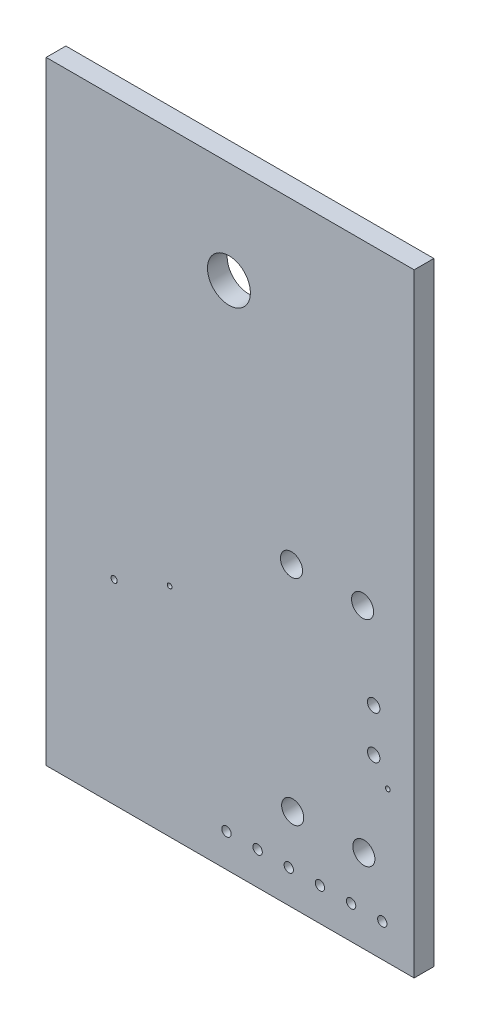
ISO-10303-21;
HEADER;
FILE_DESCRIPTION(('STEP AP214'),'2;1');
FILE_NAME('part.step','',(''),(''),'','','');
FILE_SCHEMA(('AUTOMOTIVE_DESIGN { 1 0 10303 214 1 1 1 1 }'));
ENDSEC;
DATA;
#1=APPLICATION_CONTEXT('core data for automotive mechanical design processes');
#2=APPLICATION_PROTOCOL_DEFINITION('international standard','automotive_design',2000,#1);
#3=PRODUCT_CONTEXT('',#1,'mechanical');
#4=PRODUCT('Part','Part','',(#3));
#5=PRODUCT_RELATED_PRODUCT_CATEGORY('part','',(#4));
#6=PRODUCT_DEFINITION_FORMATION('','',#4);
#7=PRODUCT_DEFINITION_CONTEXT('part definition',#1,'design');
#8=PRODUCT_DEFINITION('design','',#6,#7);
#9=PRODUCT_DEFINITION_SHAPE('','',#8);
#10=(LENGTH_UNIT() NAMED_UNIT(*) SI_UNIT(.MILLI.,.METRE.));
#11=(NAMED_UNIT(*) PLANE_ANGLE_UNIT() SI_UNIT($,.RADIAN.));
#12=(NAMED_UNIT(*) SI_UNIT($,.STERADIAN.) SOLID_ANGLE_UNIT());
#13=UNCERTAINTY_MEASURE_WITH_UNIT(LENGTH_MEASURE(1.E-05),#10,'distance_accuracy_value','');
#14=(GEOMETRIC_REPRESENTATION_CONTEXT(3) GLOBAL_UNCERTAINTY_ASSIGNED_CONTEXT((#13)) GLOBAL_UNIT_ASSIGNED_CONTEXT((#10,
#11,#12)) REPRESENTATION_CONTEXT('',''));
#15=CARTESIAN_POINT('',(0.,0.,0.));
#16=DIRECTION('',(0.,0.,1.));
#17=DIRECTION('',(1.,0.,0.));
#18=AXIS2_PLACEMENT_3D('',#15,#16,#17);
#19=CARTESIAN_POINT('',(0.,50.,-0.803));
#20=DIRECTION('',(0.,0.,-1.));
#21=DIRECTION('',(-1.,0.,0.));
#22=AXIS2_PLACEMENT_3D('',#19,#20,#21);
#23=PLANE('',#22);
#24=CARTESIAN_POINT('',(-15.1,41.7,-0.803));
#25=DIRECTION('',(0.,0.,-1.));
#26=DIRECTION('',(-1.,0.,0.));
#27=AXIS2_PLACEMENT_3D('',#24,#25,#26);
#28=CIRCLE('',#27,1.75);
#29=CARTESIAN_POINT('',(-16.85,41.7,-0.803));
#30=VERTEX_POINT('',#29);
#31=EDGE_CURVE('E124',#30,#30,#28,.F.);
#32=ORIENTED_EDGE('',*,*,#31,.T.);
#33=EDGE_LOOP('',(#32));
#34=FACE_BOUND('',#33,.T.);
#35=CARTESIAN_POINT('',(-4.2,24.2,-0.803));
#36=DIRECTION('',(0.,0.,-1.));
#37=DIRECTION('',(-1.,0.,0.));
#38=AXIS2_PLACEMENT_3D('',#35,#36,#37);
#39=CIRCLE('',#38,0.9);
#40=CARTESIAN_POINT('',(-5.1,24.2,-0.803));
#41=VERTEX_POINT('',#40);
#42=EDGE_CURVE('E127',#41,#41,#39,.F.);
#43=ORIENTED_EDGE('',*,*,#42,.T.);
#44=EDGE_LOOP('',(#43));
#45=FACE_BOUND('',#44,.T.);
#46=CARTESIAN_POINT('',(-10.,24.2,-0.803));
#47=DIRECTION('',(0.,0.,-1.));
#48=DIRECTION('',(-1.,0.,0.));
#49=AXIS2_PLACEMENT_3D('',#46,#47,#48);
#50=CIRCLE('',#49,0.9);
#51=CARTESIAN_POINT('',(-10.9,24.2,-0.803));
#52=VERTEX_POINT('',#51);
#53=EDGE_CURVE('E130',#52,#52,#50,.F.);
#54=ORIENTED_EDGE('',*,*,#53,.T.);
#55=EDGE_LOOP('',(#54));
#56=FACE_BOUND('',#55,.T.);
#57=CARTESIAN_POINT('',(-24.45854,15.91271,-0.803));
#58=DIRECTION('',(0.,0.,-1.));
#59=DIRECTION('',(-1.,0.,0.));
#60=AXIS2_PLACEMENT_3D('',#57,#58,#59);
#61=CIRCLE('',#60,0.254);
#62=CARTESIAN_POINT('',(-24.71254,15.91271,-0.803));
#63=VERTEX_POINT('',#62);
#64=EDGE_CURVE('E133',#63,#63,#61,.F.);
#65=ORIENTED_EDGE('',*,*,#64,.T.);
#66=EDGE_LOOP('',(#65));
#67=FACE_BOUND('',#66,.T.);
#68=CARTESIAN_POINT('',(-3.3,17.6,-0.803));
#69=DIRECTION('',(0.,0.,-1.));
#70=DIRECTION('',(-1.,0.,0.));
#71=AXIS2_PLACEMENT_3D('',#68,#69,#70);
#72=CIRCLE('',#71,0.508);
#73=CARTESIAN_POINT('',(-3.808,17.6,-0.803));
#74=VERTEX_POINT('',#73);
#75=EDGE_CURVE('E136',#74,#74,#72,.F.);
#76=ORIENTED_EDGE('',*,*,#75,.T.);
#77=EDGE_LOOP('',(#76));
#78=FACE_BOUND('',#77,.T.);
#79=CARTESIAN_POINT('',(-19.93533,17.71295,-0.803));
#80=DIRECTION('',(0.,0.,-1.));
#81=DIRECTION('',(-1.,0.,0.));
#82=AXIS2_PLACEMENT_3D('',#79,#80,#81);
#83=CIRCLE('',#82,0.1905);
#84=CARTESIAN_POINT('',(-20.12583,17.71295,-0.803));
#85=VERTEX_POINT('',#84);
#86=EDGE_CURVE('E139',#85,#85,#83,.F.);
#87=ORIENTED_EDGE('',*,*,#86,.T.);
#88=EDGE_LOOP('',(#87));
#89=FACE_BOUND('',#88,.T.);
#90=CARTESIAN_POINT('',(-15.3,2.7,-0.803));
#91=DIRECTION('',(0.,0.,-1.));
#92=DIRECTION('',(-1.,0.,0.));
#93=AXIS2_PLACEMENT_3D('',#90,#91,#92);
#94=CIRCLE('',#93,0.381);
#95=CARTESIAN_POINT('',(-15.681,2.7,-0.803));
#96=VERTEX_POINT('',#95);
#97=EDGE_CURVE('E142',#96,#96,#94,.F.);
#98=ORIENTED_EDGE('',*,*,#97,.T.);
#99=EDGE_LOOP('',(#98));
#100=FACE_BOUND('',#99,.T.);
#101=CARTESIAN_POINT('',(-3.3,14.1,-0.803));
#102=DIRECTION('',(0.,0.,-1.));
#103=DIRECTION('',(-1.,0.,0.));
#104=AXIS2_PLACEMENT_3D('',#101,#102,#103);
#105=CIRCLE('',#104,0.508);
#106=CARTESIAN_POINT('',(-3.808,14.1,-0.803));
#107=VERTEX_POINT('',#106);
#108=EDGE_CURVE('E145',#107,#107,#105,.F.);
#109=ORIENTED_EDGE('',*,*,#108,.T.);
#110=EDGE_LOOP('',(#109));
#111=FACE_BOUND('',#110,.T.);
#112=CARTESIAN_POINT('',(-9.9,6.8,-0.803));
#113=DIRECTION('',(0.,0.,-1.));
#114=DIRECTION('',(-1.,0.,0.));
#115=AXIS2_PLACEMENT_3D('',#112,#113,#114);
#116=CIRCLE('',#115,0.9);
#117=CARTESIAN_POINT('',(-10.8,6.8,-0.803));
#118=VERTEX_POINT('',#117);
#119=EDGE_CURVE('E148',#118,#118,#116,.F.);
#120=ORIENTED_EDGE('',*,*,#119,.T.);
#121=EDGE_LOOP('',(#120));
#122=FACE_BOUND('',#121,.T.);
#123=CARTESIAN_POINT('',(-7.68,2.7,-0.803));
#124=DIRECTION('',(0.,0.,-1.));
#125=DIRECTION('',(-1.,0.,0.));
#126=AXIS2_PLACEMENT_3D('',#123,#124,#125);
#127=CIRCLE('',#126,0.381);
#128=CARTESIAN_POINT('',(-8.061,2.7,-0.803));
#129=VERTEX_POINT('',#128);
#130=EDGE_CURVE('E151',#129,#129,#127,.F.);
#131=ORIENTED_EDGE('',*,*,#130,.T.);
#132=EDGE_LOOP('',(#131));
#133=FACE_BOUND('',#132,.T.);
#134=CARTESIAN_POINT('',(-5.14,2.7,-0.803));
#135=DIRECTION('',(0.,0.,-1.));
#136=DIRECTION('',(-1.,0.,0.));
#137=AXIS2_PLACEMENT_3D('',#134,#135,#136);
#138=CIRCLE('',#137,0.381);
#139=CARTESIAN_POINT('',(-5.521,2.7,-0.803));
#140=VERTEX_POINT('',#139);
#141=EDGE_CURVE('E154',#140,#140,#138,.F.);
#142=ORIENTED_EDGE('',*,*,#141,.T.);
#143=EDGE_LOOP('',(#142));
#144=FACE_BOUND('',#143,.T.);
#145=CARTESIAN_POINT('',(-10.22,2.7,-0.803));
#146=DIRECTION('',(0.,0.,-1.));
#147=DIRECTION('',(-1.,0.,0.));
#148=AXIS2_PLACEMENT_3D('',#145,#146,#147);
#149=CIRCLE('',#148,0.381);
#150=CARTESIAN_POINT('',(-10.601,2.7,-0.803));
#151=VERTEX_POINT('',#150);
#152=EDGE_CURVE('E157',#151,#151,#149,.F.);
#153=ORIENTED_EDGE('',*,*,#152,.T.);
#154=EDGE_LOOP('',(#153));
#155=FACE_BOUND('',#154,.T.);
#156=CARTESIAN_POINT('',(-12.76,2.7,-0.803));
#157=DIRECTION('',(0.,0.,-1.));
#158=DIRECTION('',(-1.,0.,0.));
#159=AXIS2_PLACEMENT_3D('',#156,#157,#158);
#160=CIRCLE('',#159,0.381);
#161=CARTESIAN_POINT('',(-13.141,2.7,-0.803));
#162=VERTEX_POINT('',#161);
#163=EDGE_CURVE('E160',#162,#162,#160,.F.);
#164=ORIENTED_EDGE('',*,*,#163,.T.);
#165=EDGE_LOOP('',(#164));
#166=FACE_BOUND('',#165,.T.);
#167=CARTESIAN_POINT('',(-2.6,2.7,-0.803));
#168=DIRECTION('',(0.,0.,-1.));
#169=DIRECTION('',(-1.,0.,0.));
#170=AXIS2_PLACEMENT_3D('',#167,#168,#169);
#171=CIRCLE('',#170,0.381);
#172=CARTESIAN_POINT('',(-2.981,2.7,-0.803));
#173=VERTEX_POINT('',#172);
#174=EDGE_CURVE('E163',#173,#173,#171,.F.);
#175=ORIENTED_EDGE('',*,*,#174,.T.);
#176=EDGE_LOOP('',(#175));
#177=FACE_BOUND('',#176,.T.);
#178=CARTESIAN_POINT('',(-4.1,6.8,-0.803));
#179=DIRECTION('',(0.,0.,-1.));
#180=DIRECTION('',(-1.,0.,0.));
#181=AXIS2_PLACEMENT_3D('',#178,#179,#180);
#182=CIRCLE('',#181,0.9);
#183=CARTESIAN_POINT('',(-5.,6.8,-0.803));
#184=VERTEX_POINT('',#183);
#185=EDGE_CURVE('E165',#184,#184,#182,.F.);
#186=ORIENTED_EDGE('',*,*,#185,.T.);
#187=EDGE_LOOP('',(#186));
#188=FACE_BOUND('',#187,.T.);
#189=CARTESIAN_POINT('',(-2.15327,12.27531,-0.803));
#190=DIRECTION('',(0.,0.,-1.));
#191=DIRECTION('',(-1.,0.,0.));
#192=AXIS2_PLACEMENT_3D('',#189,#190,#191);
#193=CIRCLE('',#192,0.1905);
#194=CARTESIAN_POINT('',(-2.34377,12.27531,-0.803));
#195=VERTEX_POINT('',#194);
#196=EDGE_CURVE('E19',#195,#195,#193,.F.);
#197=ORIENTED_EDGE('',*,*,#196,.T.);
#198=EDGE_LOOP('',(#197));
#199=FACE_BOUND('',#198,.T.);
#200=DIRECTION('',(1.,0.,0.));
#201=VECTOR('',#200,1.);
#202=CARTESIAN_POINT('',(-30.,0.,-0.803));
#203=LINE('',#202,#201);
#204=CARTESIAN_POINT('',(0.,0.,-0.803));
#205=VERTEX_POINT('',#204);
#206=CARTESIAN_POINT('',(-30.,0.,-0.803));
#207=VERTEX_POINT('',#206);
#208=EDGE_CURVE('E179',#205,#207,#203,.F.);
#209=ORIENTED_EDGE('',*,*,#208,.T.);
#210=DIRECTION('',(0.,1.,0.));
#211=VECTOR('',#210,1.);
#212=CARTESIAN_POINT('',(-30.,50.,-0.803));
#213=LINE('',#212,#211);
#214=CARTESIAN_POINT('',(-30.,50.,-0.803));
#215=VERTEX_POINT('',#214);
#216=EDGE_CURVE('E59',#207,#215,#213,.T.);
#217=ORIENTED_EDGE('',*,*,#216,.T.);
#218=DIRECTION('',(1.,0.,0.));
#219=VECTOR('',#218,1.);
#220=CARTESIAN_POINT('',(0.,50.,-0.803));
#221=LINE('',#220,#219);
#222=CARTESIAN_POINT('',(0.,50.,-0.803));
#223=VERTEX_POINT('',#222);
#224=EDGE_CURVE('E58',#215,#223,#221,.T.);
#225=ORIENTED_EDGE('',*,*,#224,.T.);
#226=DIRECTION('',(0.,1.,0.));
#227=VECTOR('',#226,1.);
#228=CARTESIAN_POINT('',(0.,0.,-0.803));
#229=LINE('',#228,#227);
#230=EDGE_CURVE('E55',#223,#205,#229,.F.);
#231=ORIENTED_EDGE('',*,*,#230,.T.);
#232=EDGE_LOOP('',(#209,#217,#225,#231));
#233=FACE_BOUND('',#232,.T.);
#234=ADVANCED_FACE('F16',(#34,#45,#56,#67,#78,#89,#100,#111,#122,#133,#144,#155,#166,#177,#188,
#199,#233),#23,.T.);
#235=CARTESIAN_POINT('',(0.,50.,-0.803));
#236=DIRECTION('',(0.,-1.,0.));
#237=DIRECTION('',(0.,0.,-1.));
#238=AXIS2_PLACEMENT_3D('',#235,#236,#237);
#239=PLANE('',#238);
#240=DIRECTION('',(0.,0.,-1.));
#241=VECTOR('',#240,1.);
#242=CARTESIAN_POINT('',(-30.,50.,-0.803));
#243=LINE('',#242,#241);
#244=CARTESIAN_POINT('',(-30.,50.,0.803));
#245=VERTEX_POINT('',#244);
#246=EDGE_CURVE('E173',#215,#245,#243,.F.);
#247=ORIENTED_EDGE('',*,*,#246,.T.);
#248=DIRECTION('',(-1.,0.,0.));
#249=VECTOR('',#248,1.);
#250=CARTESIAN_POINT('',(0.,50.,0.803));
#251=LINE('',#250,#249);
#252=CARTESIAN_POINT('',(0.,50.,0.803));
#253=VERTEX_POINT('',#252);
#254=EDGE_CURVE('E75',#245,#253,#251,.F.);
#255=ORIENTED_EDGE('',*,*,#254,.T.);
#256=DIRECTION('',(0.,0.,1.));
#257=VECTOR('',#256,1.);
#258=CARTESIAN_POINT('',(0.,50.,-0.803));
#259=LINE('',#258,#257);
#260=EDGE_CURVE('E64',#253,#223,#259,.F.);
#261=ORIENTED_EDGE('',*,*,#260,.T.);
#262=ORIENTED_EDGE('',*,*,#224,.F.);
#263=EDGE_LOOP('',(#247,#255,#261,#262));
#264=FACE_BOUND('',#263,.T.);
#265=ADVANCED_FACE('F74',(#264),#239,.F.);
#266=CARTESIAN_POINT('',(0.,0.,-0.803));
#267=DIRECTION('',(-1.,0.,0.));
#268=DIRECTION('',(0.,0.,1.));
#269=AXIS2_PLACEMENT_3D('',#266,#267,#268);
#270=PLANE('',#269);
#271=ORIENTED_EDGE('',*,*,#260,.F.);
#272=DIRECTION('',(0.,1.,0.));
#273=VECTOR('',#272,1.);
#274=CARTESIAN_POINT('',(0.,50.,0.803));
#275=LINE('',#274,#273);
#276=CARTESIAN_POINT('',(0.,0.,0.803));
#277=VERTEX_POINT('',#276);
#278=EDGE_CURVE('E187',#253,#277,#275,.F.);
#279=ORIENTED_EDGE('',*,*,#278,.T.);
#280=DIRECTION('',(0.,0.,1.));
#281=VECTOR('',#280,1.);
#282=CARTESIAN_POINT('',(0.,0.,-0.803));
#283=LINE('',#282,#281);
#284=EDGE_CURVE('E71',#277,#205,#283,.F.);
#285=ORIENTED_EDGE('',*,*,#284,.T.);
#286=ORIENTED_EDGE('',*,*,#230,.F.);
#287=EDGE_LOOP('',(#271,#279,#285,#286));
#288=FACE_BOUND('',#287,.T.);
#289=ADVANCED_FACE('F68',(#288),#270,.F.);
#290=CARTESIAN_POINT('',(-30.,0.,-0.803));
#291=DIRECTION('',(0.,1.,0.));
#292=DIRECTION('',(0.,0.,1.));
#293=AXIS2_PLACEMENT_3D('',#290,#291,#292);
#294=PLANE('',#293);
#295=ORIENTED_EDGE('',*,*,#284,.F.);
#296=DIRECTION('',(-1.,0.,0.));
#297=VECTOR('',#296,1.);
#298=CARTESIAN_POINT('',(0.,0.,0.803));
#299=LINE('',#298,#297);
#300=CARTESIAN_POINT('',(-30.,0.,0.803));
#301=VERTEX_POINT('',#300);
#302=EDGE_CURVE('E185',#277,#301,#299,.T.);
#303=ORIENTED_EDGE('',*,*,#302,.T.);
#304=DIRECTION('',(0.,0.,-1.));
#305=VECTOR('',#304,1.);
#306=CARTESIAN_POINT('',(-30.,0.,-0.803));
#307=LINE('',#306,#305);
#308=EDGE_CURVE('E34',#301,#207,#307,.T.);
#309=ORIENTED_EDGE('',*,*,#308,.T.);
#310=ORIENTED_EDGE('',*,*,#208,.F.);
#311=EDGE_LOOP('',(#295,#303,#309,#310));
#312=FACE_BOUND('',#311,.T.);
#313=ADVANCED_FACE('F183',(#312),#294,.F.);
#314=CARTESIAN_POINT('',(-30.,50.,-0.803));
#315=DIRECTION('',(1.,0.,0.));
#316=DIRECTION('',(0.,0.,-1.));
#317=AXIS2_PLACEMENT_3D('',#314,#315,#316);
#318=PLANE('',#317);
#319=ORIENTED_EDGE('',*,*,#308,.F.);
#320=DIRECTION('',(0.,1.,0.));
#321=VECTOR('',#320,1.);
#322=CARTESIAN_POINT('',(-30.,50.,0.803));
#323=LINE('',#322,#321);
#324=EDGE_CURVE('E123',#301,#245,#323,.T.);
#325=ORIENTED_EDGE('',*,*,#324,.T.);
#326=ORIENTED_EDGE('',*,*,#246,.F.);
#327=ORIENTED_EDGE('',*,*,#216,.F.);
#328=EDGE_LOOP('',(#319,#325,#326,#327));
#329=FACE_BOUND('',#328,.T.);
#330=ADVANCED_FACE('F181',(#329),#318,.F.);
#331=CARTESIAN_POINT('',(-2.15327,12.27531,-0.803));
#332=DIRECTION('',(0.,0.,-1.));
#333=DIRECTION('',(-1.,0.,0.));
#334=AXIS2_PLACEMENT_3D('',#331,#332,#333);
#335=CYLINDRICAL_SURFACE('',#334,0.1905);
#336=CARTESIAN_POINT('',(-2.15327,12.27531,0.803));
#337=DIRECTION('',(0.,0.,-1.));
#338=DIRECTION('',(-1.,0.,0.));
#339=AXIS2_PLACEMENT_3D('',#336,#337,#338);
#340=CIRCLE('',#339,0.1905);
#341=CARTESIAN_POINT('',(-2.34377,12.27531,0.803));
#342=VERTEX_POINT('',#341);
#343=EDGE_CURVE('E120',#342,#342,#340,.F.);
#344=ORIENTED_EDGE('',*,*,#343,.T.);
#345=EDGE_LOOP('',(#344));
#346=FACE_BOUND('',#345,.T.);
#347=ORIENTED_EDGE('',*,*,#196,.F.);
#348=EDGE_LOOP('',(#347));
#349=FACE_BOUND('',#348,.T.);
#350=ADVANCED_FACE('F259',(#346,#349),#335,.F.);
#351=CARTESIAN_POINT('',(-4.1,6.8,-0.803));
#352=DIRECTION('',(0.,0.,-1.));
#353=DIRECTION('',(-1.,0.,0.));
#354=AXIS2_PLACEMENT_3D('',#351,#352,#353);
#355=CYLINDRICAL_SURFACE('',#354,0.9);
#356=CARTESIAN_POINT('',(-4.1,6.8,0.803));
#357=DIRECTION('',(0.,0.,-1.));
#358=DIRECTION('',(-1.,0.,0.));
#359=AXIS2_PLACEMENT_3D('',#356,#357,#358);
#360=CIRCLE('',#359,0.9);
#361=CARTESIAN_POINT('',(-5.,6.8,0.803));
#362=VERTEX_POINT('',#361);
#363=EDGE_CURVE('E117',#362,#362,#360,.F.);
#364=ORIENTED_EDGE('',*,*,#363,.T.);
#365=EDGE_LOOP('',(#364));
#366=FACE_BOUND('',#365,.T.);
#367=ORIENTED_EDGE('',*,*,#185,.F.);
#368=EDGE_LOOP('',(#367));
#369=FACE_BOUND('',#368,.T.);
#370=ADVANCED_FACE('F255',(#366,#369),#355,.F.);
#371=CARTESIAN_POINT('',(-2.6,2.7,-0.803));
#372=DIRECTION('',(0.,0.,-1.));
#373=DIRECTION('',(-1.,0.,0.));
#374=AXIS2_PLACEMENT_3D('',#371,#372,#373);
#375=CYLINDRICAL_SURFACE('',#374,0.381);
#376=CARTESIAN_POINT('',(-2.6,2.7,0.803));
#377=DIRECTION('',(0.,0.,-1.));
#378=DIRECTION('',(-1.,0.,0.));
#379=AXIS2_PLACEMENT_3D('',#376,#377,#378);
#380=CIRCLE('',#379,0.381);
#381=CARTESIAN_POINT('',(-2.981,2.7,0.803));
#382=VERTEX_POINT('',#381);
#383=EDGE_CURVE('E114',#382,#382,#380,.F.);
#384=ORIENTED_EDGE('',*,*,#383,.T.);
#385=EDGE_LOOP('',(#384));
#386=FACE_BOUND('',#385,.T.);
#387=ORIENTED_EDGE('',*,*,#174,.F.);
#388=EDGE_LOOP('',(#387));
#389=FACE_BOUND('',#388,.T.);
#390=ADVANCED_FACE('F251',(#386,#389),#375,.F.);
#391=CARTESIAN_POINT('',(-12.76,2.7,-0.803));
#392=DIRECTION('',(0.,0.,-1.));
#393=DIRECTION('',(-1.,0.,0.));
#394=AXIS2_PLACEMENT_3D('',#391,#392,#393);
#395=CYLINDRICAL_SURFACE('',#394,0.381);
#396=CARTESIAN_POINT('',(-12.76,2.7,0.803));
#397=DIRECTION('',(0.,0.,-1.));
#398=DIRECTION('',(-1.,0.,0.));
#399=AXIS2_PLACEMENT_3D('',#396,#397,#398);
#400=CIRCLE('',#399,0.381);
#401=CARTESIAN_POINT('',(-13.141,2.7,0.803));
#402=VERTEX_POINT('',#401);
#403=EDGE_CURVE('E111',#402,#402,#400,.F.);
#404=ORIENTED_EDGE('',*,*,#403,.T.);
#405=EDGE_LOOP('',(#404));
#406=FACE_BOUND('',#405,.T.);
#407=ORIENTED_EDGE('',*,*,#163,.F.);
#408=EDGE_LOOP('',(#407));
#409=FACE_BOUND('',#408,.T.);
#410=ADVANCED_FACE('F247',(#406,#409),#395,.F.);
#411=CARTESIAN_POINT('',(-10.22,2.7,-0.803));
#412=DIRECTION('',(0.,0.,-1.));
#413=DIRECTION('',(-1.,0.,0.));
#414=AXIS2_PLACEMENT_3D('',#411,#412,#413);
#415=CYLINDRICAL_SURFACE('',#414,0.381);
#416=CARTESIAN_POINT('',(-10.22,2.7,0.803));
#417=DIRECTION('',(0.,0.,-1.));
#418=DIRECTION('',(-1.,0.,0.));
#419=AXIS2_PLACEMENT_3D('',#416,#417,#418);
#420=CIRCLE('',#419,0.381);
#421=CARTESIAN_POINT('',(-10.601,2.7,0.803));
#422=VERTEX_POINT('',#421);
#423=EDGE_CURVE('E108',#422,#422,#420,.F.);
#424=ORIENTED_EDGE('',*,*,#423,.T.);
#425=EDGE_LOOP('',(#424));
#426=FACE_BOUND('',#425,.T.);
#427=ORIENTED_EDGE('',*,*,#152,.F.);
#428=EDGE_LOOP('',(#427));
#429=FACE_BOUND('',#428,.T.);
#430=ADVANCED_FACE('F243',(#426,#429),#415,.F.);
#431=CARTESIAN_POINT('',(-5.14,2.7,-0.803));
#432=DIRECTION('',(0.,0.,-1.));
#433=DIRECTION('',(-1.,0.,0.));
#434=AXIS2_PLACEMENT_3D('',#431,#432,#433);
#435=CYLINDRICAL_SURFACE('',#434,0.381);
#436=CARTESIAN_POINT('',(-5.14,2.7,0.803));
#437=DIRECTION('',(0.,0.,-1.));
#438=DIRECTION('',(-1.,0.,0.));
#439=AXIS2_PLACEMENT_3D('',#436,#437,#438);
#440=CIRCLE('',#439,0.381);
#441=CARTESIAN_POINT('',(-5.521,2.7,0.803));
#442=VERTEX_POINT('',#441);
#443=EDGE_CURVE('E105',#442,#442,#440,.F.);
#444=ORIENTED_EDGE('',*,*,#443,.T.);
#445=EDGE_LOOP('',(#444));
#446=FACE_BOUND('',#445,.T.);
#447=ORIENTED_EDGE('',*,*,#141,.F.);
#448=EDGE_LOOP('',(#447));
#449=FACE_BOUND('',#448,.T.);
#450=ADVANCED_FACE('F239',(#446,#449),#435,.F.);
#451=CARTESIAN_POINT('',(-7.68,2.7,-0.803));
#452=DIRECTION('',(0.,0.,-1.));
#453=DIRECTION('',(-1.,0.,0.));
#454=AXIS2_PLACEMENT_3D('',#451,#452,#453);
#455=CYLINDRICAL_SURFACE('',#454,0.381);
#456=CARTESIAN_POINT('',(-7.68,2.7,0.803));
#457=DIRECTION('',(0.,0.,-1.));
#458=DIRECTION('',(-1.,0.,0.));
#459=AXIS2_PLACEMENT_3D('',#456,#457,#458);
#460=CIRCLE('',#459,0.381);
#461=CARTESIAN_POINT('',(-8.061,2.7,0.803));
#462=VERTEX_POINT('',#461);
#463=EDGE_CURVE('E102',#462,#462,#460,.F.);
#464=ORIENTED_EDGE('',*,*,#463,.T.);
#465=EDGE_LOOP('',(#464));
#466=FACE_BOUND('',#465,.T.);
#467=ORIENTED_EDGE('',*,*,#130,.F.);
#468=EDGE_LOOP('',(#467));
#469=FACE_BOUND('',#468,.T.);
#470=ADVANCED_FACE('F235',(#466,#469),#455,.F.);
#471=CARTESIAN_POINT('',(-9.9,6.8,-0.803));
#472=DIRECTION('',(0.,0.,-1.));
#473=DIRECTION('',(-1.,0.,0.));
#474=AXIS2_PLACEMENT_3D('',#471,#472,#473);
#475=CYLINDRICAL_SURFACE('',#474,0.9);
#476=CARTESIAN_POINT('',(-9.9,6.8,0.803));
#477=DIRECTION('',(0.,0.,-1.));
#478=DIRECTION('',(-1.,0.,0.));
#479=AXIS2_PLACEMENT_3D('',#476,#477,#478);
#480=CIRCLE('',#479,0.9);
#481=CARTESIAN_POINT('',(-10.8,6.8,0.803));
#482=VERTEX_POINT('',#481);
#483=EDGE_CURVE('E99',#482,#482,#480,.F.);
#484=ORIENTED_EDGE('',*,*,#483,.T.);
#485=EDGE_LOOP('',(#484));
#486=FACE_BOUND('',#485,.T.);
#487=ORIENTED_EDGE('',*,*,#119,.F.);
#488=EDGE_LOOP('',(#487));
#489=FACE_BOUND('',#488,.T.);
#490=ADVANCED_FACE('F231',(#486,#489),#475,.F.);
#491=CARTESIAN_POINT('',(-3.3,14.1,-0.803));
#492=DIRECTION('',(0.,0.,-1.));
#493=DIRECTION('',(-1.,0.,0.));
#494=AXIS2_PLACEMENT_3D('',#491,#492,#493);
#495=CYLINDRICAL_SURFACE('',#494,0.508);
#496=CARTESIAN_POINT('',(-3.3,14.1,0.803));
#497=DIRECTION('',(0.,0.,-1.));
#498=DIRECTION('',(-1.,0.,0.));
#499=AXIS2_PLACEMENT_3D('',#496,#497,#498);
#500=CIRCLE('',#499,0.508);
#501=CARTESIAN_POINT('',(-3.808,14.1,0.803));
#502=VERTEX_POINT('',#501);
#503=EDGE_CURVE('E96',#502,#502,#500,.F.);
#504=ORIENTED_EDGE('',*,*,#503,.T.);
#505=EDGE_LOOP('',(#504));
#506=FACE_BOUND('',#505,.T.);
#507=ORIENTED_EDGE('',*,*,#108,.F.);
#508=EDGE_LOOP('',(#507));
#509=FACE_BOUND('',#508,.T.);
#510=ADVANCED_FACE('F227',(#506,#509),#495,.F.);
#511=CARTESIAN_POINT('',(-15.3,2.7,-0.803));
#512=DIRECTION('',(0.,0.,-1.));
#513=DIRECTION('',(-1.,0.,0.));
#514=AXIS2_PLACEMENT_3D('',#511,#512,#513);
#515=CYLINDRICAL_SURFACE('',#514,0.381);
#516=CARTESIAN_POINT('',(-15.3,2.7,0.803));
#517=DIRECTION('',(0.,0.,-1.));
#518=DIRECTION('',(-1.,0.,0.));
#519=AXIS2_PLACEMENT_3D('',#516,#517,#518);
#520=CIRCLE('',#519,0.381);
#521=CARTESIAN_POINT('',(-15.681,2.7,0.803));
#522=VERTEX_POINT('',#521);
#523=EDGE_CURVE('E93',#522,#522,#520,.F.);
#524=ORIENTED_EDGE('',*,*,#523,.T.);
#525=EDGE_LOOP('',(#524));
#526=FACE_BOUND('',#525,.T.);
#527=ORIENTED_EDGE('',*,*,#97,.F.);
#528=EDGE_LOOP('',(#527));
#529=FACE_BOUND('',#528,.T.);
#530=ADVANCED_FACE('F223',(#526,#529),#515,.F.);
#531=CARTESIAN_POINT('',(-19.93533,17.71295,-0.803));
#532=DIRECTION('',(0.,0.,-1.));
#533=DIRECTION('',(-1.,0.,0.));
#534=AXIS2_PLACEMENT_3D('',#531,#532,#533);
#535=CYLINDRICAL_SURFACE('',#534,0.1905);
#536=CARTESIAN_POINT('',(-19.93533,17.71295,0.803));
#537=DIRECTION('',(0.,0.,-1.));
#538=DIRECTION('',(-1.,0.,0.));
#539=AXIS2_PLACEMENT_3D('',#536,#537,#538);
#540=CIRCLE('',#539,0.1905);
#541=CARTESIAN_POINT('',(-20.12583,17.71295,0.803));
#542=VERTEX_POINT('',#541);
#543=EDGE_CURVE('E90',#542,#542,#540,.F.);
#544=ORIENTED_EDGE('',*,*,#543,.T.);
#545=EDGE_LOOP('',(#544));
#546=FACE_BOUND('',#545,.T.);
#547=ORIENTED_EDGE('',*,*,#86,.F.);
#548=EDGE_LOOP('',(#547));
#549=FACE_BOUND('',#548,.T.);
#550=ADVANCED_FACE('F219',(#546,#549),#535,.F.);
#551=CARTESIAN_POINT('',(-3.3,17.6,-0.803));
#552=DIRECTION('',(0.,0.,-1.));
#553=DIRECTION('',(-1.,0.,0.));
#554=AXIS2_PLACEMENT_3D('',#551,#552,#553);
#555=CYLINDRICAL_SURFACE('',#554,0.508);
#556=CARTESIAN_POINT('',(-3.3,17.6,0.803));
#557=DIRECTION('',(0.,0.,-1.));
#558=DIRECTION('',(-1.,0.,0.));
#559=AXIS2_PLACEMENT_3D('',#556,#557,#558);
#560=CIRCLE('',#559,0.508);
#561=CARTESIAN_POINT('',(-3.808,17.6,0.803));
#562=VERTEX_POINT('',#561);
#563=EDGE_CURVE('E87',#562,#562,#560,.F.);
#564=ORIENTED_EDGE('',*,*,#563,.T.);
#565=EDGE_LOOP('',(#564));
#566=FACE_BOUND('',#565,.T.);
#567=ORIENTED_EDGE('',*,*,#75,.F.);
#568=EDGE_LOOP('',(#567));
#569=FACE_BOUND('',#568,.T.);
#570=ADVANCED_FACE('F215',(#566,#569),#555,.F.);
#571=CARTESIAN_POINT('',(-24.45854,15.91271,-0.803));
#572=DIRECTION('',(0.,0.,-1.));
#573=DIRECTION('',(-1.,0.,0.));
#574=AXIS2_PLACEMENT_3D('',#571,#572,#573);
#575=CYLINDRICAL_SURFACE('',#574,0.254);
#576=CARTESIAN_POINT('',(-24.45854,15.91271,0.803));
#577=DIRECTION('',(0.,0.,-1.));
#578=DIRECTION('',(-1.,0.,0.));
#579=AXIS2_PLACEMENT_3D('',#576,#577,#578);
#580=CIRCLE('',#579,0.254);
#581=CARTESIAN_POINT('',(-24.71254,15.91271,0.803));
#582=VERTEX_POINT('',#581);
#583=EDGE_CURVE('E84',#582,#582,#580,.F.);
#584=ORIENTED_EDGE('',*,*,#583,.T.);
#585=EDGE_LOOP('',(#584));
#586=FACE_BOUND('',#585,.T.);
#587=ORIENTED_EDGE('',*,*,#64,.F.);
#588=EDGE_LOOP('',(#587));
#589=FACE_BOUND('',#588,.T.);
#590=ADVANCED_FACE('F211',(#586,#589),#575,.F.);
#591=CARTESIAN_POINT('',(-10.,24.2,-0.803));
#592=DIRECTION('',(0.,0.,-1.));
#593=DIRECTION('',(-1.,0.,0.));
#594=AXIS2_PLACEMENT_3D('',#591,#592,#593);
#595=CYLINDRICAL_SURFACE('',#594,0.9);
#596=CARTESIAN_POINT('',(-10.,24.2,0.803));
#597=DIRECTION('',(0.,0.,-1.));
#598=DIRECTION('',(-1.,0.,0.));
#599=AXIS2_PLACEMENT_3D('',#596,#597,#598);
#600=CIRCLE('',#599,0.9);
#601=CARTESIAN_POINT('',(-10.9,24.2,0.803));
#602=VERTEX_POINT('',#601);
#603=EDGE_CURVE('E81',#602,#602,#600,.F.);
#604=ORIENTED_EDGE('',*,*,#603,.T.);
#605=EDGE_LOOP('',(#604));
#606=FACE_BOUND('',#605,.T.);
#607=ORIENTED_EDGE('',*,*,#53,.F.);
#608=EDGE_LOOP('',(#607));
#609=FACE_BOUND('',#608,.T.);
#610=ADVANCED_FACE('F207',(#606,#609),#595,.F.);
#611=CARTESIAN_POINT('',(-4.2,24.2,-0.803));
#612=DIRECTION('',(0.,0.,-1.));
#613=DIRECTION('',(-1.,0.,0.));
#614=AXIS2_PLACEMENT_3D('',#611,#612,#613);
#615=CYLINDRICAL_SURFACE('',#614,0.9);
#616=CARTESIAN_POINT('',(-4.2,24.2,0.803));
#617=DIRECTION('',(0.,0.,-1.));
#618=DIRECTION('',(-1.,0.,0.));
#619=AXIS2_PLACEMENT_3D('',#616,#617,#618);
#620=CIRCLE('',#619,0.9);
#621=CARTESIAN_POINT('',(-5.1,24.2,0.803));
#622=VERTEX_POINT('',#621);
#623=EDGE_CURVE('E25',#622,#622,#620,.F.);
#624=ORIENTED_EDGE('',*,*,#623,.T.);
#625=EDGE_LOOP('',(#624));
#626=FACE_BOUND('',#625,.T.);
#627=ORIENTED_EDGE('',*,*,#42,.F.);
#628=EDGE_LOOP('',(#627));
#629=FACE_BOUND('',#628,.T.);
#630=ADVANCED_FACE('F199',(#626,#629),#615,.F.);
#631=CARTESIAN_POINT('',(-15.1,41.7,-0.803));
#632=DIRECTION('',(0.,0.,-1.));
#633=DIRECTION('',(-1.,0.,0.));
#634=AXIS2_PLACEMENT_3D('',#631,#632,#633);
#635=CYLINDRICAL_SURFACE('',#634,1.75);
#636=CARTESIAN_POINT('',(-15.1,41.7,0.803));
#637=DIRECTION('',(0.,0.,-1.));
#638=DIRECTION('',(-1.,0.,0.));
#639=AXIS2_PLACEMENT_3D('',#636,#637,#638);
#640=CIRCLE('',#639,1.75);
#641=CARTESIAN_POINT('',(-16.85,41.7,0.803));
#642=VERTEX_POINT('',#641);
#643=EDGE_CURVE('E11',#642,#642,#640,.F.);
#644=ORIENTED_EDGE('',*,*,#643,.T.);
#645=EDGE_LOOP('',(#644));
#646=FACE_BOUND('',#645,.T.);
#647=ORIENTED_EDGE('',*,*,#31,.F.);
#648=EDGE_LOOP('',(#647));
#649=FACE_BOUND('',#648,.T.);
#650=ADVANCED_FACE('F192',(#646,#649),#635,.F.);
#651=CARTESIAN_POINT('',(0.,50.,0.803));
#652=DIRECTION('',(0.,0.,-1.));
#653=DIRECTION('',(-1.,0.,0.));
#654=AXIS2_PLACEMENT_3D('',#651,#652,#653);
#655=PLANE('',#654);
#656=ORIENTED_EDGE('',*,*,#643,.F.);
#657=EDGE_LOOP('',(#656));
#658=FACE_BOUND('',#657,.T.);
#659=ORIENTED_EDGE('',*,*,#623,.F.);
#660=EDGE_LOOP('',(#659));
#661=FACE_BOUND('',#660,.T.);
#662=ORIENTED_EDGE('',*,*,#603,.F.);
#663=EDGE_LOOP('',(#662));
#664=FACE_BOUND('',#663,.T.);
#665=ORIENTED_EDGE('',*,*,#583,.F.);
#666=EDGE_LOOP('',(#665));
#667=FACE_BOUND('',#666,.T.);
#668=ORIENTED_EDGE('',*,*,#563,.F.);
#669=EDGE_LOOP('',(#668));
#670=FACE_BOUND('',#669,.T.);
#671=ORIENTED_EDGE('',*,*,#543,.F.);
#672=EDGE_LOOP('',(#671));
#673=FACE_BOUND('',#672,.T.);
#674=ORIENTED_EDGE('',*,*,#523,.F.);
#675=EDGE_LOOP('',(#674));
#676=FACE_BOUND('',#675,.T.);
#677=ORIENTED_EDGE('',*,*,#503,.F.);
#678=EDGE_LOOP('',(#677));
#679=FACE_BOUND('',#678,.T.);
#680=ORIENTED_EDGE('',*,*,#483,.F.);
#681=EDGE_LOOP('',(#680));
#682=FACE_BOUND('',#681,.T.);
#683=ORIENTED_EDGE('',*,*,#463,.F.);
#684=EDGE_LOOP('',(#683));
#685=FACE_BOUND('',#684,.T.);
#686=ORIENTED_EDGE('',*,*,#443,.F.);
#687=EDGE_LOOP('',(#686));
#688=FACE_BOUND('',#687,.T.);
#689=ORIENTED_EDGE('',*,*,#423,.F.);
#690=EDGE_LOOP('',(#689));
#691=FACE_BOUND('',#690,.T.);
#692=ORIENTED_EDGE('',*,*,#403,.F.);
#693=EDGE_LOOP('',(#692));
#694=FACE_BOUND('',#693,.T.);
#695=ORIENTED_EDGE('',*,*,#383,.F.);
#696=EDGE_LOOP('',(#695));
#697=FACE_BOUND('',#696,.T.);
#698=ORIENTED_EDGE('',*,*,#363,.F.);
#699=EDGE_LOOP('',(#698));
#700=FACE_BOUND('',#699,.T.);
#701=ORIENTED_EDGE('',*,*,#343,.F.);
#702=EDGE_LOOP('',(#701));
#703=FACE_BOUND('',#702,.T.);
#704=ORIENTED_EDGE('',*,*,#302,.F.);
#705=ORIENTED_EDGE('',*,*,#278,.F.);
#706=ORIENTED_EDGE('',*,*,#254,.F.);
#707=ORIENTED_EDGE('',*,*,#324,.F.);
#708=EDGE_LOOP('',(#704,#705,#706,#707));
#709=FACE_BOUND('',#708,.T.);
#710=ADVANCED_FACE('F190',(#658,#661,#664,#667,#670,#673,#676,#679,#682,#685,#688,#691,#694,
#697,#700,#703,#709),#655,.F.);
#711=CLOSED_SHELL('',(#234,#265,#289,#313,#330,#350,#370,#390,#410,#430,#450,#470,#490,#510,
#530,#550,#570,#590,#610,#630,#650,#710));
#712=MANIFOLD_SOLID_BREP('B1',#711);
#713=ADVANCED_BREP_SHAPE_REPRESENTATION('',(#18,#712),#14);
#714=SHAPE_DEFINITION_REPRESENTATION(#9,#713);
ENDSEC;
END-ISO-10303-21;
